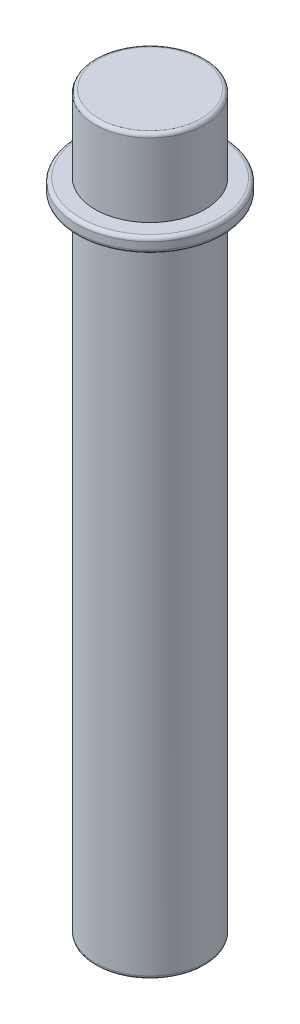
ISO-10303-21;
HEADER;
FILE_DESCRIPTION(('STEP AP214'),'2;1');
FILE_NAME('part.step','',(''),(''),'','','');
FILE_SCHEMA(('AUTOMOTIVE_DESIGN { 1 0 10303 214 1 1 1 1 }'));
ENDSEC;
DATA;
#1=APPLICATION_CONTEXT('core data for automotive mechanical design processes');
#2=APPLICATION_PROTOCOL_DEFINITION('international standard','automotive_design',2000,#1);
#3=PRODUCT_CONTEXT('',#1,'mechanical');
#4=PRODUCT('Part','Part','',(#3));
#5=PRODUCT_RELATED_PRODUCT_CATEGORY('part','',(#4));
#6=PRODUCT_DEFINITION_FORMATION('','',#4);
#7=PRODUCT_DEFINITION_CONTEXT('part definition',#1,'design');
#8=PRODUCT_DEFINITION('design','',#6,#7);
#9=PRODUCT_DEFINITION_SHAPE('','',#8);
#10=(LENGTH_UNIT() NAMED_UNIT(*) SI_UNIT(.MILLI.,.METRE.));
#11=(NAMED_UNIT(*) PLANE_ANGLE_UNIT() SI_UNIT($,.RADIAN.));
#12=(NAMED_UNIT(*) SI_UNIT($,.STERADIAN.) SOLID_ANGLE_UNIT());
#13=UNCERTAINTY_MEASURE_WITH_UNIT(LENGTH_MEASURE(1.E-05),#10,'distance_accuracy_value','');
#14=(GEOMETRIC_REPRESENTATION_CONTEXT(3) GLOBAL_UNCERTAINTY_ASSIGNED_CONTEXT((#13)) GLOBAL_UNIT_ASSIGNED_CONTEXT((#10,
#11,#12)) REPRESENTATION_CONTEXT('',''));
#15=CARTESIAN_POINT('',(0.,0.,0.));
#16=DIRECTION('',(0.,0.,1.));
#17=DIRECTION('',(1.,0.,0.));
#18=AXIS2_PLACEMENT_3D('',#15,#16,#17);
#19=CARTESIAN_POINT('',(0.,20.,0.));
#20=DIRECTION('',(0.,-1.,0.));
#21=DIRECTION('',(0.,0.,-1.));
#22=AXIS2_PLACEMENT_3D('',#19,#20,#21);
#23=CYLINDRICAL_SURFACE('',#22,1.5);
#24=CARTESIAN_POINT('',(0.,0.0999999999999994,0.));
#25=DIRECTION('',(0.,1.,0.));
#26=DIRECTION('',(0.,0.,1.));
#27=AXIS2_PLACEMENT_3D('',#24,#25,#26);
#28=CIRCLE('',#27,1.5);
#29=CARTESIAN_POINT('',(0.,0.0999999999999994,1.5));
#30=VERTEX_POINT('',#29);
#31=EDGE_CURVE('E42',#30,#30,#28,.T.);
#32=ORIENTED_EDGE('',*,*,#31,.T.);
#33=EDGE_LOOP('',(#32));
#34=FACE_BOUND('',#33,.T.);
#35=CARTESIAN_POINT('',(0.,17.5,0.));
#36=DIRECTION('',(0.,-1.,0.));
#37=DIRECTION('',(0.,0.,-1.));
#38=AXIS2_PLACEMENT_3D('',#35,#36,#37);
#39=CIRCLE('',#38,1.5);
#40=CARTESIAN_POINT('',(0.,17.5,-1.5));
#41=VERTEX_POINT('',#40);
#42=EDGE_CURVE('E70',#41,#41,#39,.T.);
#43=ORIENTED_EDGE('',*,*,#42,.T.);
#44=EDGE_LOOP('',(#43));
#45=FACE_BOUND('',#44,.T.);
#46=ADVANCED_FACE('F35',(#34,#45),#23,.T.);
#47=CARTESIAN_POINT('',(0.,0.,0.));
#48=DIRECTION('',(0.,1.,0.));
#49=DIRECTION('',(0.,0.,1.));
#50=AXIS2_PLACEMENT_3D('',#47,#48,#49);
#51=PLANE('',#50);
#52=CARTESIAN_POINT('',(0.,0.,0.));
#53=DIRECTION('',(0.,1.,0.));
#54=DIRECTION('',(0.,0.,1.));
#55=AXIS2_PLACEMENT_3D('',#52,#53,#54);
#56=CIRCLE('',#55,1.4);
#57=CARTESIAN_POINT('',(0.,0.,1.4));
#58=VERTEX_POINT('',#57);
#59=EDGE_CURVE('E10',#58,#58,#56,.F.);
#60=ORIENTED_EDGE('',*,*,#59,.T.);
#61=EDGE_LOOP('',(#60));
#62=FACE_BOUND('',#61,.T.);
#63=ADVANCED_FACE('F78',(#62),#51,.F.);
#64=CARTESIAN_POINT('',(0.,17.5,0.));
#65=DIRECTION('',(0.,-1.,0.));
#66=DIRECTION('',(0.,0.,-1.));
#67=AXIS2_PLACEMENT_3D('',#64,#65,#66);
#68=PLANE('',#67);
#69=CARTESIAN_POINT('',(0.,17.5,0.));
#70=DIRECTION('',(0.,-1.,0.));
#71=DIRECTION('',(0.,0.,-1.));
#72=AXIS2_PLACEMENT_3D('',#69,#70,#71);
#73=CIRCLE('',#72,1.9);
#74=CARTESIAN_POINT('',(0.,17.5,-1.9));
#75=VERTEX_POINT('',#74);
#76=EDGE_CURVE('E64',#75,#75,#73,.T.);
#77=ORIENTED_EDGE('',*,*,#76,.T.);
#78=EDGE_LOOP('',(#77));
#79=FACE_BOUND('',#78,.T.);
#80=ORIENTED_EDGE('',*,*,#42,.F.);
#81=EDGE_LOOP('',(#80));
#82=FACE_BOUND('',#81,.T.);
#83=ADVANCED_FACE('F75',(#79,#82),#68,.T.);
#84=CARTESIAN_POINT('',(0.,17.9,0.));
#85=DIRECTION('',(0.,-1.,0.));
#86=DIRECTION('',(0.,0.,-1.));
#87=AXIS2_PLACEMENT_3D('',#84,#85,#86);
#88=PLANE('',#87);
#89=CARTESIAN_POINT('',(0.,17.9,0.));
#90=DIRECTION('',(0.,-1.,0.));
#91=DIRECTION('',(0.,0.,-1.));
#92=AXIS2_PLACEMENT_3D('',#89,#90,#91);
#93=CIRCLE('',#92,1.9);
#94=CARTESIAN_POINT('',(0.,17.9,-1.9));
#95=VERTEX_POINT('',#94);
#96=EDGE_CURVE('E55',#95,#95,#93,.F.);
#97=ORIENTED_EDGE('',*,*,#96,.T.);
#98=EDGE_LOOP('',(#97));
#99=FACE_BOUND('',#98,.T.);
#100=CARTESIAN_POINT('',(0.,17.9,0.));
#101=DIRECTION('',(0.,-1.,0.));
#102=DIRECTION('',(0.,0.,-1.));
#103=AXIS2_PLACEMENT_3D('',#100,#101,#102);
#104=CIRCLE('',#103,1.5);
#105=CARTESIAN_POINT('',(0.,17.9,-1.5));
#106=VERTEX_POINT('',#105);
#107=EDGE_CURVE('E67',#106,#106,#104,.T.);
#108=ORIENTED_EDGE('',*,*,#107,.T.);
#109=EDGE_LOOP('',(#108));
#110=FACE_BOUND('',#109,.T.);
#111=ADVANCED_FACE('F77',(#99,#110),#88,.F.);
#112=CARTESIAN_POINT('',(0.,17.5,0.));
#113=DIRECTION('',(0.,1.,0.));
#114=DIRECTION('',(0.,0.,1.));
#115=AXIS2_PLACEMENT_3D('',#112,#113,#114);
#116=CYLINDRICAL_SURFACE('',#115,2.);
#117=CARTESIAN_POINT('',(0.,17.6,0.));
#118=DIRECTION('',(0.,-1.,0.));
#119=DIRECTION('',(0.,0.,-1.));
#120=AXIS2_PLACEMENT_3D('',#117,#118,#119);
#121=CIRCLE('',#120,2.);
#122=CARTESIAN_POINT('',(0.,17.6,-2.));
#123=VERTEX_POINT('',#122);
#124=EDGE_CURVE('E58',#123,#123,#121,.F.);
#125=ORIENTED_EDGE('',*,*,#124,.T.);
#126=EDGE_LOOP('',(#125));
#127=FACE_BOUND('',#126,.T.);
#128=CARTESIAN_POINT('',(0.,17.8,0.));
#129=DIRECTION('',(0.,-1.,0.));
#130=DIRECTION('',(0.,0.,-1.));
#131=AXIS2_PLACEMENT_3D('',#128,#129,#130);
#132=CIRCLE('',#131,2.);
#133=CARTESIAN_POINT('',(0.,17.8,-2.));
#134=VERTEX_POINT('',#133);
#135=EDGE_CURVE('E61',#134,#134,#132,.T.);
#136=ORIENTED_EDGE('',*,*,#135,.T.);
#137=EDGE_LOOP('',(#136));
#138=FACE_BOUND('',#137,.T.);
#139=ADVANCED_FACE('F85',(#127,#138),#116,.T.);
#140=CARTESIAN_POINT('',(0.,20.,0.));
#141=DIRECTION('',(0.,1.,0.));
#142=DIRECTION('',(0.,0.,1.));
#143=AXIS2_PLACEMENT_3D('',#140,#141,#142);
#144=PLANE('',#143);
#145=CARTESIAN_POINT('',(0.,20.,0.));
#146=DIRECTION('',(0.,1.,0.));
#147=DIRECTION('',(0.,0.,1.));
#148=AXIS2_PLACEMENT_3D('',#145,#146,#147);
#149=CIRCLE('',#148,1.4);
#150=CARTESIAN_POINT('',(0.,20.,1.4));
#151=VERTEX_POINT('',#150);
#152=EDGE_CURVE('E50',#151,#151,#149,.T.);
#153=ORIENTED_EDGE('',*,*,#152,.T.);
#154=EDGE_LOOP('',(#153));
#155=FACE_BOUND('',#154,.T.);
#156=ADVANCED_FACE('F97',(#155),#144,.T.);
#157=CARTESIAN_POINT('',(0.,19.9,0.));
#158=DIRECTION('',(0.,1.,0.));
#159=DIRECTION('',(0.,0.,1.));
#160=AXIS2_PLACEMENT_3D('',#157,#158,#159);
#161=CIRCLE('',#160,1.5);
#162=CARTESIAN_POINT('',(0.,19.9,1.5));
#163=VERTEX_POINT('',#162);
#164=EDGE_CURVE('E46',#163,#163,#161,.F.);
#165=ORIENTED_EDGE('',*,*,#164,.T.);
#166=EDGE_LOOP('',(#165));
#167=FACE_BOUND('',#166,.T.);
#168=ORIENTED_EDGE('',*,*,#107,.F.);
#169=EDGE_LOOP('',(#168));
#170=FACE_BOUND('',#169,.T.);
#171=ADVANCED_FACE('F91',(#167,#170),#23,.T.);
#172=CARTESIAN_POINT('',(0.,17.6,0.));
#173=DIRECTION('',(0.,-1.,0.));
#174=DIRECTION('',(0.,0.,-1.));
#175=AXIS2_PLACEMENT_3D('',#172,#173,#174);
#176=TOROIDAL_SURFACE('',#175,1.9,0.1);
#177=ORIENTED_EDGE('',*,*,#124,.F.);
#178=EDGE_LOOP('',(#177));
#179=FACE_BOUND('',#178,.T.);
#180=ORIENTED_EDGE('',*,*,#76,.F.);
#181=EDGE_LOOP('',(#180));
#182=FACE_BOUND('',#181,.T.);
#183=ADVANCED_FACE('F96',(#179,#182),#176,.T.);
#184=CARTESIAN_POINT('',(0.,17.8,0.));
#185=DIRECTION('',(0.,-1.,0.));
#186=DIRECTION('',(0.,0.,-1.));
#187=AXIS2_PLACEMENT_3D('',#184,#185,#186);
#188=TOROIDAL_SURFACE('',#187,1.9,0.1);
#189=ORIENTED_EDGE('',*,*,#96,.F.);
#190=EDGE_LOOP('',(#189));
#191=FACE_BOUND('',#190,.T.);
#192=ORIENTED_EDGE('',*,*,#135,.F.);
#193=EDGE_LOOP('',(#192));
#194=FACE_BOUND('',#193,.T.);
#195=ADVANCED_FACE('F103',(#191,#194),#188,.T.);
#196=CARTESIAN_POINT('',(0.,19.9,0.));
#197=DIRECTION('',(0.,1.,0.));
#198=DIRECTION('',(0.,0.,1.));
#199=AXIS2_PLACEMENT_3D('',#196,#197,#198);
#200=TOROIDAL_SURFACE('',#199,1.4,0.1);
#201=ORIENTED_EDGE('',*,*,#164,.F.);
#202=EDGE_LOOP('',(#201));
#203=FACE_BOUND('',#202,.T.);
#204=ORIENTED_EDGE('',*,*,#152,.F.);
#205=EDGE_LOOP('',(#204));
#206=FACE_BOUND('',#205,.T.);
#207=ADVANCED_FACE('F112',(#203,#206),#200,.T.);
#208=CARTESIAN_POINT('',(0.,0.0999999999999994,0.));
#209=DIRECTION('',(0.,1.,0.));
#210=DIRECTION('',(0.,0.,1.));
#211=AXIS2_PLACEMENT_3D('',#208,#209,#210);
#212=TOROIDAL_SURFACE('',#211,1.4,0.1);
#213=ORIENTED_EDGE('',*,*,#59,.F.);
#214=EDGE_LOOP('',(#213));
#215=FACE_BOUND('',#214,.T.);
#216=ORIENTED_EDGE('',*,*,#31,.F.);
#217=EDGE_LOOP('',(#216));
#218=FACE_BOUND('',#217,.T.);
#219=ADVANCED_FACE('F37',(#215,#218),#212,.T.);
#220=CLOSED_SHELL('',(#46,#63,#83,#111,#139,#156,#171,#183,#195,#207,#219));
#221=MANIFOLD_SOLID_BREP('B2',#220);
#222=ADVANCED_BREP_SHAPE_REPRESENTATION('',(#18,#221),#14);
#223=SHAPE_DEFINITION_REPRESENTATION(#9,#222);
ENDSEC;
END-ISO-10303-21;
